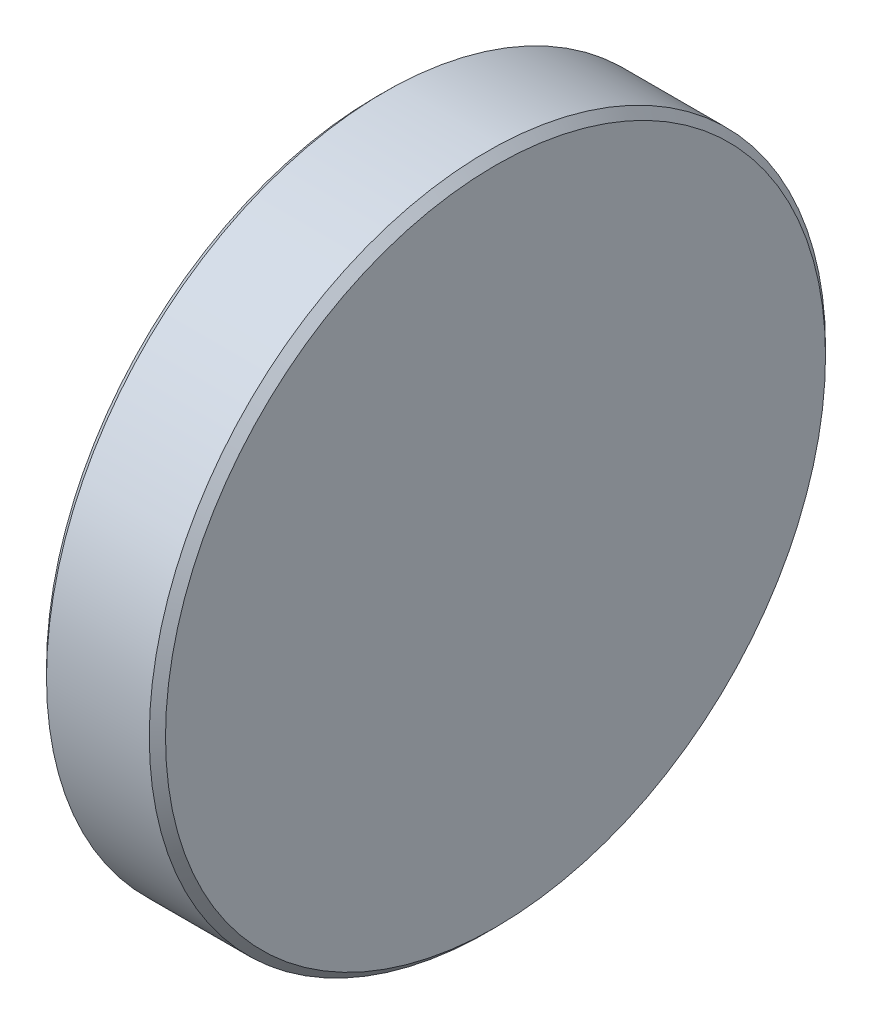
ISO-10303-21;
HEADER;
FILE_DESCRIPTION(('STEP AP214'),'2;1');
FILE_NAME('part.step','',(''),(''),'','','');
FILE_SCHEMA(('AUTOMOTIVE_DESIGN { 1 0 10303 214 1 1 1 1 }'));
ENDSEC;
DATA;
#1=APPLICATION_CONTEXT('core data for automotive mechanical design processes');
#2=APPLICATION_PROTOCOL_DEFINITION('international standard','automotive_design',2000,#1);
#3=PRODUCT_CONTEXT('',#1,'mechanical');
#4=PRODUCT('Part','Part','',(#3));
#5=PRODUCT_RELATED_PRODUCT_CATEGORY('part','',(#4));
#6=PRODUCT_DEFINITION_FORMATION('','',#4);
#7=PRODUCT_DEFINITION_CONTEXT('part definition',#1,'design');
#8=PRODUCT_DEFINITION('design','',#6,#7);
#9=PRODUCT_DEFINITION_SHAPE('','',#8);
#10=(LENGTH_UNIT() NAMED_UNIT(*) SI_UNIT(.MILLI.,.METRE.));
#11=(NAMED_UNIT(*) PLANE_ANGLE_UNIT() SI_UNIT($,.RADIAN.));
#12=(NAMED_UNIT(*) SI_UNIT($,.STERADIAN.) SOLID_ANGLE_UNIT());
#13=UNCERTAINTY_MEASURE_WITH_UNIT(LENGTH_MEASURE(1.E-05),#10,'distance_accuracy_value','');
#14=(GEOMETRIC_REPRESENTATION_CONTEXT(3) GLOBAL_UNCERTAINTY_ASSIGNED_CONTEXT((#13)) GLOBAL_UNIT_ASSIGNED_CONTEXT((#10,
#11,#12)) REPRESENTATION_CONTEXT('',''));
#15=CARTESIAN_POINT('',(0.,0.,0.));
#16=DIRECTION('',(0.,0.,1.));
#17=DIRECTION('',(1.,0.,0.));
#18=AXIS2_PLACEMENT_3D('',#15,#16,#17);
#19=CARTESIAN_POINT('',(22.352,0.,0.));
#20=DIRECTION('',(-1.,0.,0.));
#21=DIRECTION('',(0.,0.,1.));
#22=AXIS2_PLACEMENT_3D('',#19,#20,#21);
#23=CYLINDRICAL_SURFACE('',#22,63.5);
#24=CARTESIAN_POINT('',(20.828,0.,0.));
#25=DIRECTION('',(1.,0.,0.));
#26=DIRECTION('',(0.,0.,-1.));
#27=AXIS2_PLACEMENT_3D('',#24,#25,#26);
#28=CIRCLE('',#27,63.5);
#29=CARTESIAN_POINT('',(20.828,0.,63.5));
#30=VERTEX_POINT('',#29);
#31=EDGE_CURVE('E47',#30,#30,#28,.F.);
#32=ORIENTED_EDGE('',*,*,#31,.T.);
#33=EDGE_LOOP('',(#32));
#34=FACE_BOUND('',#33,.T.);
#35=CARTESIAN_POINT('',(1.52399999999998,0.,0.));
#36=DIRECTION('',(1.,0.,0.));
#37=DIRECTION('',(0.,0.,-1.));
#38=AXIS2_PLACEMENT_3D('',#35,#36,#37);
#39=CIRCLE('',#38,63.5);
#40=CARTESIAN_POINT('',(1.52399999999998,0.,-63.5));
#41=VERTEX_POINT('',#40);
#42=EDGE_CURVE('E51',#41,#41,#39,.T.);
#43=ORIENTED_EDGE('',*,*,#42,.T.);
#44=EDGE_LOOP('',(#43));
#45=FACE_BOUND('',#44,.T.);
#46=ADVANCED_FACE('F39',(#34,#45),#23,.T.);
#47=CARTESIAN_POINT('',(22.352,0.,0.));
#48=DIRECTION('',(1.,0.,0.));
#49=DIRECTION('',(0.,0.,-1.));
#50=AXIS2_PLACEMENT_3D('',#47,#48,#49);
#51=PLANE('',#50);
#52=CARTESIAN_POINT('',(22.352,0.,0.));
#53=DIRECTION('',(1.,0.,0.));
#54=DIRECTION('',(0.,0.,-1.));
#55=AXIS2_PLACEMENT_3D('',#52,#53,#54);
#56=CIRCLE('',#55,61.976);
#57=CARTESIAN_POINT('',(22.352,0.,61.976));
#58=VERTEX_POINT('',#57);
#59=EDGE_CURVE('E55',#58,#58,#56,.T.);
#60=ORIENTED_EDGE('',*,*,#59,.T.);
#61=EDGE_LOOP('',(#60));
#62=FACE_BOUND('',#61,.T.);
#63=ADVANCED_FACE('F61',(#62),#51,.T.);
#64=CARTESIAN_POINT('',(0.,0.,0.));
#65=DIRECTION('',(1.,0.,0.));
#66=DIRECTION('',(0.,0.,-1.));
#67=AXIS2_PLACEMENT_3D('',#64,#65,#66);
#68=PLANE('',#67);
#69=CARTESIAN_POINT('',(0.,0.,0.));
#70=DIRECTION('',(1.,0.,0.));
#71=DIRECTION('',(0.,0.,-1.));
#72=AXIS2_PLACEMENT_3D('',#69,#70,#71);
#73=CIRCLE('',#72,61.976);
#74=CARTESIAN_POINT('',(0.,0.,-61.976));
#75=VERTEX_POINT('',#74);
#76=EDGE_CURVE('E10',#75,#75,#73,.F.);
#77=ORIENTED_EDGE('',*,*,#76,.T.);
#78=EDGE_LOOP('',(#77));
#79=FACE_BOUND('',#78,.T.);
#80=ADVANCED_FACE('F65',(#79),#68,.F.);
#81=CARTESIAN_POINT('',(22.352,0.,0.));
#82=DIRECTION('',(-1.,0.,0.));
#83=DIRECTION('',(0.,0.,1.));
#84=AXIS2_PLACEMENT_3D('',#81,#82,#83);
#85=CONICAL_SURFACE('',#84,61.976,0.785398163397448);
#86=CARTESIAN_POINT('',(20.828,0.,63.5));
#87=CARTESIAN_POINT('',(20.843875,0.,63.484125));
#88=CARTESIAN_POINT('',(20.85975,0.,63.46825));
#89=CARTESIAN_POINT('',(20.8915,0.,63.4365));
#90=CARTESIAN_POINT('',(20.907375,0.,63.420625));
#91=CARTESIAN_POINT('',(20.939125,0.,63.388875));
#92=CARTESIAN_POINT('',(20.955,0.,63.373));
#93=CARTESIAN_POINT('',(20.98675,0.,63.34125));
#94=CARTESIAN_POINT('',(21.002625,0.,63.325375));
#95=CARTESIAN_POINT('',(21.034375,0.,63.293625));
#96=CARTESIAN_POINT('',(21.05025,0.,63.27775));
#97=CARTESIAN_POINT('',(21.082,0.,63.246));
#98=CARTESIAN_POINT('',(21.097875,0.,63.230125));
#99=CARTESIAN_POINT('',(21.129625,0.,63.198375));
#100=CARTESIAN_POINT('',(21.1455,0.,63.1825));
#101=CARTESIAN_POINT('',(21.17725,0.,63.15075));
#102=CARTESIAN_POINT('',(21.193125,0.,63.134875));
#103=CARTESIAN_POINT('',(21.224875,0.,63.103125));
#104=CARTESIAN_POINT('',(21.24075,0.,63.08725));
#105=CARTESIAN_POINT('',(21.2725,0.,63.0555));
#106=CARTESIAN_POINT('',(21.288375,0.,63.039625));
#107=CARTESIAN_POINT('',(21.320125,0.,63.007875));
#108=CARTESIAN_POINT('',(21.336,0.,62.992));
#109=CARTESIAN_POINT('',(21.36775,0.,62.96025));
#110=CARTESIAN_POINT('',(21.383625,0.,62.944375));
#111=CARTESIAN_POINT('',(21.415375,0.,62.912625));
#112=CARTESIAN_POINT('',(21.43125,0.,62.89675));
#113=CARTESIAN_POINT('',(21.463,0.,62.865));
#114=CARTESIAN_POINT('',(21.478875,0.,62.849125));
#115=CARTESIAN_POINT('',(21.510625,0.,62.817375));
#116=CARTESIAN_POINT('',(21.5265,0.,62.8015));
#117=CARTESIAN_POINT('',(21.55825,0.,62.76975));
#118=CARTESIAN_POINT('',(21.574125,0.,62.753875));
#119=CARTESIAN_POINT('',(21.605875,0.,62.722125));
#120=CARTESIAN_POINT('',(21.62175,0.,62.70625));
#121=CARTESIAN_POINT('',(21.6535,0.,62.6745));
#122=CARTESIAN_POINT('',(21.669375,0.,62.658625));
#123=CARTESIAN_POINT('',(21.701125,0.,62.626875));
#124=CARTESIAN_POINT('',(21.717,0.,62.611));
#125=CARTESIAN_POINT('',(21.74875,0.,62.57925));
#126=CARTESIAN_POINT('',(21.764625,0.,62.563375));
#127=CARTESIAN_POINT('',(21.796375,0.,62.531625));
#128=CARTESIAN_POINT('',(21.81225,0.,62.51575));
#129=CARTESIAN_POINT('',(21.844,0.,62.484));
#130=CARTESIAN_POINT('',(21.859875,0.,62.468125));
#131=CARTESIAN_POINT('',(21.891625,0.,62.436375));
#132=CARTESIAN_POINT('',(21.9075,0.,62.4205));
#133=CARTESIAN_POINT('',(21.93925,0.,62.38875));
#134=CARTESIAN_POINT('',(21.955125,0.,62.372875));
#135=CARTESIAN_POINT('',(21.986875,0.,62.341125));
#136=CARTESIAN_POINT('',(22.00275,0.,62.32525));
#137=CARTESIAN_POINT('',(22.0345,0.,62.2935));
#138=CARTESIAN_POINT('',(22.050375,0.,62.277625));
#139=CARTESIAN_POINT('',(22.082125,0.,62.245875));
#140=CARTESIAN_POINT('',(22.098,0.,62.23));
#141=CARTESIAN_POINT('',(22.12975,0.,62.19825));
#142=CARTESIAN_POINT('',(22.145625,0.,62.182375));
#143=CARTESIAN_POINT('',(22.177375,0.,62.150625));
#144=CARTESIAN_POINT('',(22.19325,0.,62.13475));
#145=CARTESIAN_POINT('',(22.225,0.,62.103));
#146=CARTESIAN_POINT('',(22.240875,0.,62.087125));
#147=CARTESIAN_POINT('',(22.272625,0.,62.055375));
#148=CARTESIAN_POINT('',(22.2885,0.,62.0395));
#149=CARTESIAN_POINT('',(22.32025,0.,62.00775));
#150=CARTESIAN_POINT('',(22.336125,0.,61.991875));
#151=CARTESIAN_POINT('',(22.352,0.,61.976));
#152=B_SPLINE_CURVE_WITH_KNOTS('',3,(#86,#87,#88,#89,#90,#91,#92,#93,#94,#95,#96,#97,#98,#99,
#100,#101,#102,#103,#104,#105,#106,#107,#108,#109,#110,#111,#112,#113,#114,#115,#116,#117,#118,
#119,#120,#121,#122,#123,#124,#125,#126,#127,#128,#129,#130,#131,#132,#133,#134,#135,#136,#137,
#138,#139,#140,#141,#142,#143,#144,#145,#146,#147,#148,#149,#150,#151),.UNSPECIFIED.,.F.,.F.,(4,
2,2,2,2,2,2,2,2,2,2,2,2,2,2,2,2,2,2,2,2,2,2,2,2,2,2,2,2,2,2,2,4),(0.,0.0673519209080149,
0.134703841816042,0.202055762724057,0.269407683632074,0.336759604540099,0.404111525448116,
0.471463446356131,0.538815367264158,0.606167288172173,0.6735192090802,0.740871129988215,
0.808223050896232,0.875574971804257,0.942926892712274,1.0102788136203,1.07763073452832,
1.14498265543633,1.21233457634436,1.27968649725237,1.34703841816039,1.41439033906842,
1.48174225997643,1.54909418088445,1.61644610179247,1.68379802270049,1.75114994360851,
1.81850186451653,1.88585378542455,1.95320570633257,2.02055762724059,2.08790954814861,
2.15526146905663),.UNSPECIFIED.);
#153=EDGE_CURVE('BSEAM63',#30,#58,#152,.T.);
#154=ORIENTED_EDGE('',*,*,#31,.F.);
#155=ORIENTED_EDGE('',*,*,#59,.F.);
#156=ORIENTED_EDGE('',*,*,#153,.T.);
#157=ORIENTED_EDGE('',*,*,#153,.F.);
#158=EDGE_LOOP('',(#154,#156,#155,#157));
#159=FACE_BOUND('',#158,.T.);
#160=ADVANCED_FACE('F63',(#159),#85,.T.);
#161=CARTESIAN_POINT('',(1.52399999999998,0.,0.));
#162=DIRECTION('',(1.,0.,0.));
#163=DIRECTION('',(0.,0.,-1.));
#164=AXIS2_PLACEMENT_3D('',#161,#162,#163);
#165=CONICAL_SURFACE('',#164,63.5,0.785398163397453);
#166=ORIENTED_EDGE('',*,*,#76,.F.);
#167=EDGE_LOOP('',(#166));
#168=FACE_BOUND('',#167,.T.);
#169=ORIENTED_EDGE('',*,*,#42,.F.);
#170=EDGE_LOOP('',(#169));
#171=FACE_BOUND('',#170,.T.);
#172=ADVANCED_FACE('F42',(#168,#171),#165,.T.);
#173=CLOSED_SHELL('',(#46,#63,#80,#160,#172));
#174=MANIFOLD_SOLID_BREP('B2',#173);
#175=ADVANCED_BREP_SHAPE_REPRESENTATION('',(#18,#174),#14);
#176=SHAPE_DEFINITION_REPRESENTATION(#9,#175);
ENDSEC;
END-ISO-10303-21;
